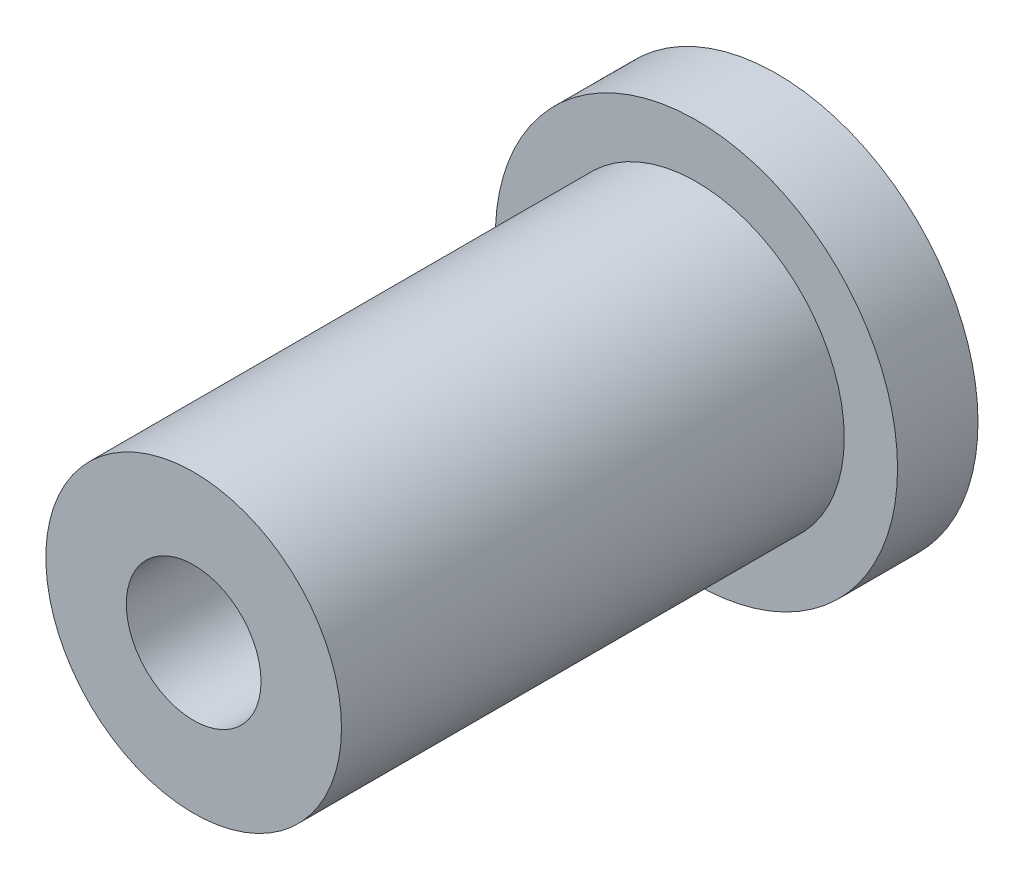
ISO-10303-21;
HEADER;
FILE_DESCRIPTION(('STEP AP214'),'2;1');
FILE_NAME('part.step','',(''),(''),'','','');
FILE_SCHEMA(('AUTOMOTIVE_DESIGN { 1 0 10303 214 1 1 1 1 }'));
ENDSEC;
DATA;
#1=APPLICATION_CONTEXT('core data for automotive mechanical design processes');
#2=APPLICATION_PROTOCOL_DEFINITION('international standard','automotive_design',2000,#1);
#3=PRODUCT_CONTEXT('',#1,'mechanical');
#4=PRODUCT('Part','Part','',(#3));
#5=PRODUCT_RELATED_PRODUCT_CATEGORY('part','',(#4));
#6=PRODUCT_DEFINITION_FORMATION('','',#4);
#7=PRODUCT_DEFINITION_CONTEXT('part definition',#1,'design');
#8=PRODUCT_DEFINITION('design','',#6,#7);
#9=PRODUCT_DEFINITION_SHAPE('','',#8);
#10=(LENGTH_UNIT() NAMED_UNIT(*) SI_UNIT(.MILLI.,.METRE.));
#11=(NAMED_UNIT(*) PLANE_ANGLE_UNIT() SI_UNIT($,.RADIAN.));
#12=(NAMED_UNIT(*) SI_UNIT($,.STERADIAN.) SOLID_ANGLE_UNIT());
#13=UNCERTAINTY_MEASURE_WITH_UNIT(LENGTH_MEASURE(1.E-05),#10,'distance_accuracy_value','');
#14=(GEOMETRIC_REPRESENTATION_CONTEXT(3) GLOBAL_UNCERTAINTY_ASSIGNED_CONTEXT((#13)) GLOBAL_UNIT_ASSIGNED_CONTEXT((#10,
#11,#12)) REPRESENTATION_CONTEXT('',''));
#15=CARTESIAN_POINT('',(0.,0.,0.));
#16=DIRECTION('',(0.,0.,1.));
#17=DIRECTION('',(1.,0.,0.));
#18=AXIS2_PLACEMENT_3D('',#15,#16,#17);
#19=CARTESIAN_POINT('',(0.,0.,4.));
#20=DIRECTION('',(0.,0.,1.));
#21=DIRECTION('',(1.,0.,0.));
#22=AXIS2_PLACEMENT_3D('',#19,#20,#21);
#23=PLANE('',#22);
#24=CARTESIAN_POINT('',(0.,0.,4.));
#25=DIRECTION('',(0.,0.,1.));
#26=DIRECTION('',(1.,0.,0.));
#27=AXIS2_PLACEMENT_3D('',#24,#25,#26);
#28=CIRCLE('',#27,7.35);
#29=CARTESIAN_POINT('',(7.35,0.,4.));
#30=VERTEX_POINT('',#29);
#31=EDGE_CURVE('E70',#30,#30,#28,.T.);
#32=ORIENTED_EDGE('',*,*,#31,.F.);
#33=EDGE_LOOP('',(#32));
#34=FACE_BOUND('',#33,.T.);
#35=CARTESIAN_POINT('',(0.,0.,4.));
#36=DIRECTION('',(0.,0.,1.));
#37=DIRECTION('',(1.,0.,0.));
#38=AXIS2_PLACEMENT_3D('',#35,#36,#37);
#39=CIRCLE('',#38,10.);
#40=CARTESIAN_POINT('',(10.,0.,4.));
#41=VERTEX_POINT('',#40);
#42=EDGE_CURVE('E11',#41,#41,#39,.T.);
#43=ORIENTED_EDGE('',*,*,#42,.T.);
#44=EDGE_LOOP('',(#43));
#45=FACE_BOUND('',#44,.T.);
#46=ADVANCED_FACE('F51',(#34,#45),#23,.T.);
#47=CARTESIAN_POINT('',(0.,0.,0.));
#48=DIRECTION('',(0.,0.,1.));
#49=DIRECTION('',(1.,0.,0.));
#50=AXIS2_PLACEMENT_3D('',#47,#48,#49);
#51=PLANE('',#50);
#52=CARTESIAN_POINT('',(0.,0.,0.));
#53=DIRECTION('',(0.,0.,1.));
#54=DIRECTION('',(1.,0.,0.));
#55=AXIS2_PLACEMENT_3D('',#52,#53,#54);
#56=CIRCLE('',#55,10.);
#57=CARTESIAN_POINT('',(10.,0.,0.));
#58=VERTEX_POINT('',#57);
#59=EDGE_CURVE('E55',#58,#58,#56,.T.);
#60=ORIENTED_EDGE('',*,*,#59,.F.);
#61=EDGE_LOOP('',(#60));
#62=FACE_BOUND('',#61,.T.);
#63=CARTESIAN_POINT('',(0.,0.,0.));
#64=DIRECTION('',(0.,0.,1.));
#65=DIRECTION('',(1.,0.,0.));
#66=AXIS2_PLACEMENT_3D('',#63,#64,#65);
#67=CIRCLE('',#66,4.);
#68=CARTESIAN_POINT('',(4.,0.,0.));
#69=VERTEX_POINT('',#68);
#70=EDGE_CURVE('E62',#69,#69,#67,.T.);
#71=ORIENTED_EDGE('',*,*,#70,.T.);
#72=EDGE_LOOP('',(#71));
#73=FACE_BOUND('',#72,.T.);
#74=ADVANCED_FACE('F102',(#62,#73),#51,.F.);
#75=CARTESIAN_POINT('',(0.,0.,4.));
#76=DIRECTION('',(0.,0.,-1.));
#77=DIRECTION('',(-1.,0.,0.));
#78=AXIS2_PLACEMENT_3D('',#75,#76,#77);
#79=CYLINDRICAL_SURFACE('',#78,10.);
#80=ORIENTED_EDGE('',*,*,#42,.F.);
#81=EDGE_LOOP('',(#80));
#82=FACE_BOUND('',#81,.T.);
#83=ORIENTED_EDGE('',*,*,#59,.T.);
#84=EDGE_LOOP('',(#83));
#85=FACE_BOUND('',#84,.T.);
#86=ADVANCED_FACE('F53',(#82,#85),#79,.T.);
#87=CARTESIAN_POINT('',(0.,0.,4.));
#88=DIRECTION('',(0.,0.,-1.));
#89=DIRECTION('',(-1.,0.,0.));
#90=AXIS2_PLACEMENT_3D('',#87,#88,#89);
#91=CYLINDRICAL_SURFACE('',#90,4.);
#92=CARTESIAN_POINT('',(0.,0.,4.));
#93=DIRECTION('',(0.,0.,1.));
#94=DIRECTION('',(1.,0.,0.));
#95=AXIS2_PLACEMENT_3D('',#92,#93,#94);
#96=CIRCLE('',#95,4.);
#97=CARTESIAN_POINT('',(4.,0.,4.));
#98=VERTEX_POINT('',#97);
#99=EDGE_CURVE('E66',#98,#98,#96,.T.);
#100=ORIENTED_EDGE('',*,*,#99,.T.);
#101=EDGE_LOOP('',(#100));
#102=FACE_BOUND('',#101,.T.);
#103=ORIENTED_EDGE('',*,*,#70,.F.);
#104=EDGE_LOOP('',(#103));
#105=FACE_BOUND('',#104,.T.);
#106=ADVANCED_FACE('F97',(#102,#105),#91,.F.);
#107=CARTESIAN_POINT('',(0.,0.,4.));
#108=DIRECTION('',(0.,0.,1.));
#109=DIRECTION('',(1.,0.,0.));
#110=AXIS2_PLACEMENT_3D('',#107,#108,#109);
#111=PLANE('',#110);
#112=CARTESIAN_POINT('',(0.,0.,4.));
#113=DIRECTION('',(0.,0.,1.));
#114=DIRECTION('',(1.,0.,0.));
#115=AXIS2_PLACEMENT_3D('',#112,#113,#114);
#116=CIRCLE('',#115,3.35);
#117=CARTESIAN_POINT('',(3.35,0.,4.));
#118=VERTEX_POINT('',#117);
#119=EDGE_CURVE('E76',#118,#118,#116,.T.);
#120=ORIENTED_EDGE('',*,*,#119,.T.);
#121=EDGE_LOOP('',(#120));
#122=FACE_BOUND('',#121,.T.);
#123=ORIENTED_EDGE('',*,*,#99,.F.);
#124=EDGE_LOOP('',(#123));
#125=FACE_BOUND('',#124,.T.);
#126=ADVANCED_FACE('F88',(#122,#125),#111,.F.);
#127=CARTESIAN_POINT('',(0.,0.,29.));
#128=DIRECTION('',(0.,0.,1.));
#129=DIRECTION('',(1.,0.,0.));
#130=AXIS2_PLACEMENT_3D('',#127,#128,#129);
#131=PLANE('',#130);
#132=CARTESIAN_POINT('',(0.,0.,29.));
#133=DIRECTION('',(0.,0.,1.));
#134=DIRECTION('',(1.,0.,0.));
#135=AXIS2_PLACEMENT_3D('',#132,#133,#134);
#136=CIRCLE('',#135,7.35);
#137=CARTESIAN_POINT('',(7.35,0.,29.));
#138=VERTEX_POINT('',#137);
#139=EDGE_CURVE('E69',#138,#138,#136,.T.);
#140=ORIENTED_EDGE('',*,*,#139,.T.);
#141=EDGE_LOOP('',(#140));
#142=FACE_BOUND('',#141,.T.);
#143=CARTESIAN_POINT('',(0.,0.,29.));
#144=DIRECTION('',(0.,0.,1.));
#145=DIRECTION('',(1.,0.,0.));
#146=AXIS2_PLACEMENT_3D('',#143,#144,#145);
#147=CIRCLE('',#146,3.35);
#148=CARTESIAN_POINT('',(3.35,0.,29.));
#149=VERTEX_POINT('',#148);
#150=EDGE_CURVE('E73',#149,#149,#147,.T.);
#151=ORIENTED_EDGE('',*,*,#150,.F.);
#152=EDGE_LOOP('',(#151));
#153=FACE_BOUND('',#152,.T.);
#154=ADVANCED_FACE('F85',(#142,#153),#131,.T.);
#155=CARTESIAN_POINT('',(0.,0.,29.));
#156=DIRECTION('',(0.,0.,-1.));
#157=DIRECTION('',(-1.,0.,0.));
#158=AXIS2_PLACEMENT_3D('',#155,#156,#157);
#159=CYLINDRICAL_SURFACE('',#158,7.35);
#160=ORIENTED_EDGE('',*,*,#139,.F.);
#161=EDGE_LOOP('',(#160));
#162=FACE_BOUND('',#161,.T.);
#163=ORIENTED_EDGE('',*,*,#31,.T.);
#164=EDGE_LOOP('',(#163));
#165=FACE_BOUND('',#164,.T.);
#166=ADVANCED_FACE('F87',(#162,#165),#159,.T.);
#167=CARTESIAN_POINT('',(0.,0.,29.));
#168=DIRECTION('',(0.,0.,-1.));
#169=DIRECTION('',(-1.,0.,0.));
#170=AXIS2_PLACEMENT_3D('',#167,#168,#169);
#171=CYLINDRICAL_SURFACE('',#170,3.35);
#172=ORIENTED_EDGE('',*,*,#150,.T.);
#173=EDGE_LOOP('',(#172));
#174=FACE_BOUND('',#173,.T.);
#175=ORIENTED_EDGE('',*,*,#119,.F.);
#176=EDGE_LOOP('',(#175));
#177=FACE_BOUND('',#176,.T.);
#178=ADVANCED_FACE('F82',(#174,#177),#171,.F.);
#179=CLOSED_SHELL('',(#46,#74,#86,#106,#126,#154,#166,#178));
#180=MANIFOLD_SOLID_BREP('B2',#179);
#181=ADVANCED_BREP_SHAPE_REPRESENTATION('',(#18,#180),#14);
#182=SHAPE_DEFINITION_REPRESENTATION(#9,#181);
ENDSEC;
END-ISO-10303-21;
